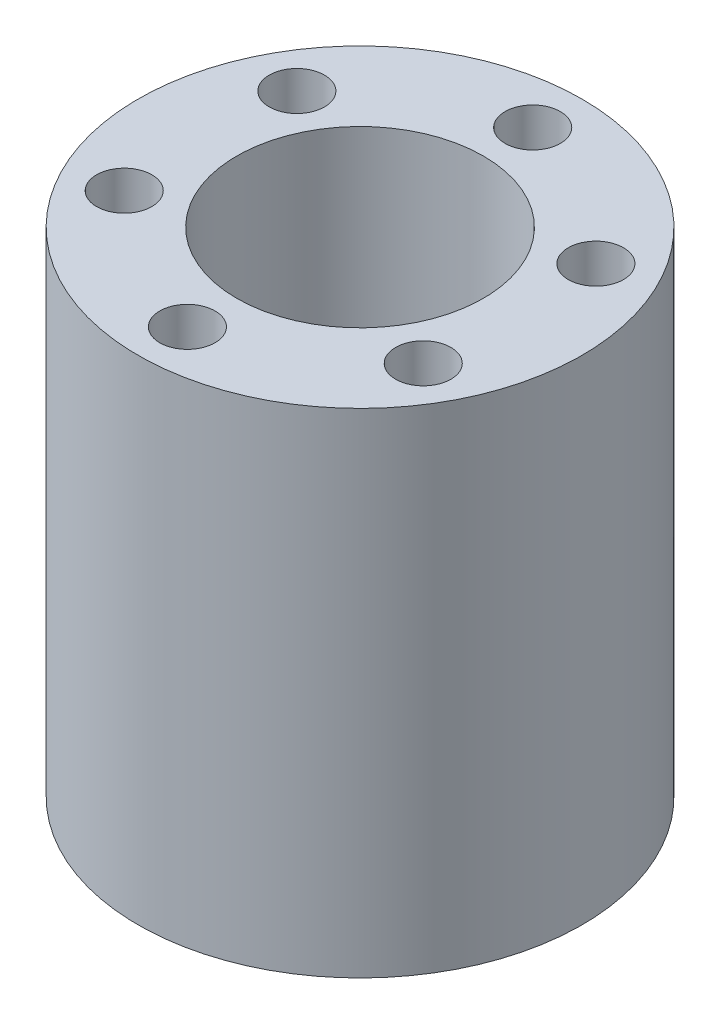
ISO-10303-21;
HEADER;
FILE_DESCRIPTION(('STEP AP214'),'2;1');
FILE_NAME('part.step','',(''),(''),'','','');
FILE_SCHEMA(('AUTOMOTIVE_DESIGN { 1 0 10303 214 1 1 1 1 }'));
ENDSEC;
DATA;
#1=APPLICATION_CONTEXT('core data for automotive mechanical design processes');
#2=APPLICATION_PROTOCOL_DEFINITION('international standard','automotive_design',2000,#1);
#3=PRODUCT_CONTEXT('',#1,'mechanical');
#4=PRODUCT('Part','Part','',(#3));
#5=PRODUCT_RELATED_PRODUCT_CATEGORY('part','',(#4));
#6=PRODUCT_DEFINITION_FORMATION('','',#4);
#7=PRODUCT_DEFINITION_CONTEXT('part definition',#1,'design');
#8=PRODUCT_DEFINITION('design','',#6,#7);
#9=PRODUCT_DEFINITION_SHAPE('','',#8);
#10=(LENGTH_UNIT() NAMED_UNIT(*) SI_UNIT(.MILLI.,.METRE.));
#11=(NAMED_UNIT(*) PLANE_ANGLE_UNIT() SI_UNIT($,.RADIAN.));
#12=(NAMED_UNIT(*) SI_UNIT($,.STERADIAN.) SOLID_ANGLE_UNIT());
#13=UNCERTAINTY_MEASURE_WITH_UNIT(LENGTH_MEASURE(1.E-05),#10,'distance_accuracy_value','');
#14=(GEOMETRIC_REPRESENTATION_CONTEXT(3) GLOBAL_UNCERTAINTY_ASSIGNED_CONTEXT((#13)) GLOBAL_UNIT_ASSIGNED_CONTEXT((#10,
#11,#12)) REPRESENTATION_CONTEXT('',''));
#15=CARTESIAN_POINT('',(0.,0.,0.));
#16=DIRECTION('',(0.,0.,1.));
#17=DIRECTION('',(1.,0.,0.));
#18=AXIS2_PLACEMENT_3D('',#15,#16,#17);
#19=CARTESIAN_POINT('',(0.,0.,0.));
#20=DIRECTION('',(0.,-1.,0.));
#21=DIRECTION('',(0.,0.,-1.));
#22=AXIS2_PLACEMENT_3D('',#19,#20,#21);
#23=CYLINDRICAL_SURFACE('',#22,12.5);
#24=CARTESIAN_POINT('',(0.,25.,0.));
#25=DIRECTION('',(0.,-1.,0.));
#26=DIRECTION('',(0.,0.,-1.));
#27=AXIS2_PLACEMENT_3D('',#24,#25,#26);
#28=CIRCLE('',#27,12.5);
#29=CARTESIAN_POINT('',(0.,25.,-12.5));
#30=VERTEX_POINT('',#29);
#31=EDGE_CURVE('E11',#30,#30,#28,.T.);
#32=ORIENTED_EDGE('',*,*,#31,.F.);
#33=EDGE_LOOP('',(#32));
#34=FACE_BOUND('',#33,.T.);
#35=CARTESIAN_POINT('',(0.,-25.,0.));
#36=DIRECTION('',(0.,-1.,0.));
#37=DIRECTION('',(0.,0.,-1.));
#38=AXIS2_PLACEMENT_3D('',#35,#36,#37);
#39=CIRCLE('',#38,12.5);
#40=CARTESIAN_POINT('',(0.,-25.,-12.5));
#41=VERTEX_POINT('',#40);
#42=EDGE_CURVE('E151',#41,#41,#39,.T.);
#43=ORIENTED_EDGE('',*,*,#42,.T.);
#44=EDGE_LOOP('',(#43));
#45=FACE_BOUND('',#44,.T.);
#46=ADVANCED_FACE('F45',(#34,#45),#23,.F.);
#47=CARTESIAN_POINT('',(12.5,25.,0.));
#48=DIRECTION('',(0.,1.,0.));
#49=DIRECTION('',(0.,0.,1.));
#50=AXIS2_PLACEMENT_3D('',#47,#48,#49);
#51=PLANE('',#50);
#52=CARTESIAN_POINT('',(0.,25.,17.5));
#53=DIRECTION('',(0.,1.,0.));
#54=DIRECTION('',(0.,0.,1.));
#55=AXIS2_PLACEMENT_3D('',#52,#53,#54);
#56=CIRCLE('',#55,2.79999999999999);
#57=CARTESIAN_POINT('',(0.,25.,20.3));
#58=VERTEX_POINT('',#57);
#59=EDGE_CURVE('E155',#58,#58,#56,.T.);
#60=ORIENTED_EDGE('',*,*,#59,.F.);
#61=EDGE_LOOP('',(#60));
#62=FACE_BOUND('',#61,.T.);
#63=CARTESIAN_POINT('',(-15.1554445662277,25.,8.74999999999997));
#64=DIRECTION('',(0.,1.,0.));
#65=DIRECTION('',(0.,0.,1.));
#66=AXIS2_PLACEMENT_3D('',#63,#64,#65);
#67=CIRCLE('',#66,2.79999999999999);
#68=CARTESIAN_POINT('',(-15.1554445662277,25.,11.55));
#69=VERTEX_POINT('',#68);
#70=EDGE_CURVE('E163',#69,#69,#67,.T.);
#71=ORIENTED_EDGE('',*,*,#70,.F.);
#72=EDGE_LOOP('',(#71));
#73=FACE_BOUND('',#72,.T.);
#74=CARTESIAN_POINT('',(-15.1554445662276,25.,-8.75000000000007));
#75=DIRECTION('',(0.,1.,0.));
#76=DIRECTION('',(0.,0.,1.));
#77=AXIS2_PLACEMENT_3D('',#74,#75,#76);
#78=CIRCLE('',#77,2.79999999999999);
#79=CARTESIAN_POINT('',(-15.1554445662276,25.,-5.95000000000008));
#80=VERTEX_POINT('',#79);
#81=EDGE_CURVE('E171',#80,#80,#78,.T.);
#82=ORIENTED_EDGE('',*,*,#81,.F.);
#83=EDGE_LOOP('',(#82));
#84=FACE_BOUND('',#83,.T.);
#85=CARTESIAN_POINT('',(1.2220184685951E-13,25.,-17.5));
#86=DIRECTION('',(0.,1.,0.));
#87=DIRECTION('',(0.,0.,1.));
#88=AXIS2_PLACEMENT_3D('',#85,#86,#87);
#89=CIRCLE('',#88,2.79999999999999);
#90=CARTESIAN_POINT('',(1.2220184685951E-13,25.,-14.7));
#91=VERTEX_POINT('',#90);
#92=EDGE_CURVE('E179',#91,#91,#89,.T.);
#93=ORIENTED_EDGE('',*,*,#92,.F.);
#94=EDGE_LOOP('',(#93));
#95=FACE_BOUND('',#94,.T.);
#96=CARTESIAN_POINT('',(15.1554445662278,25.,-8.74999999999986));
#97=DIRECTION('',(0.,1.,0.));
#98=DIRECTION('',(0.,0.,1.));
#99=AXIS2_PLACEMENT_3D('',#96,#97,#98);
#100=CIRCLE('',#99,2.79999999999999);
#101=CARTESIAN_POINT('',(15.1554445662278,25.,-5.94999999999987));
#102=VERTEX_POINT('',#101);
#103=EDGE_CURVE('E187',#102,#102,#100,.T.);
#104=ORIENTED_EDGE('',*,*,#103,.F.);
#105=EDGE_LOOP('',(#104));
#106=FACE_BOUND('',#105,.T.);
#107=CARTESIAN_POINT('',(15.1554445662276,25.,8.75000000000018));
#108=DIRECTION('',(0.,1.,0.));
#109=DIRECTION('',(0.,0.,1.));
#110=AXIS2_PLACEMENT_3D('',#107,#108,#109);
#111=CIRCLE('',#110,2.79999999999999);
#112=CARTESIAN_POINT('',(15.1554445662276,25.,11.5500000000002));
#113=VERTEX_POINT('',#112);
#114=EDGE_CURVE('E195',#113,#113,#111,.T.);
#115=ORIENTED_EDGE('',*,*,#114,.F.);
#116=EDGE_LOOP('',(#115));
#117=FACE_BOUND('',#116,.T.);
#118=ORIENTED_EDGE('',*,*,#31,.T.);
#119=EDGE_LOOP('',(#118));
#120=FACE_BOUND('',#119,.T.);
#121=CARTESIAN_POINT('',(0.,25.,0.));
#122=DIRECTION('',(0.,-1.,0.));
#123=DIRECTION('',(0.,0.,-1.));
#124=AXIS2_PLACEMENT_3D('',#121,#122,#123);
#125=CIRCLE('',#124,22.5);
#126=CARTESIAN_POINT('',(0.,25.,-22.5));
#127=VERTEX_POINT('',#126);
#128=EDGE_CURVE('E53',#127,#127,#125,.T.);
#129=ORIENTED_EDGE('',*,*,#128,.F.);
#130=EDGE_LOOP('',(#129));
#131=FACE_BOUND('',#130,.T.);
#132=ADVANCED_FACE('F209',(#62,#73,#84,#95,#106,#117,#120,#131),#51,.T.);
#133=CARTESIAN_POINT('',(0.,0.,0.));
#134=DIRECTION('',(0.,-1.,0.));
#135=DIRECTION('',(0.,0.,-1.));
#136=AXIS2_PLACEMENT_3D('',#133,#134,#135);
#137=CYLINDRICAL_SURFACE('',#136,22.5);
#138=ORIENTED_EDGE('',*,*,#128,.T.);
#139=EDGE_LOOP('',(#138));
#140=FACE_BOUND('',#139,.T.);
#141=CARTESIAN_POINT('',(0.,-25.,0.));
#142=DIRECTION('',(0.,-1.,0.));
#143=DIRECTION('',(0.,0.,-1.));
#144=AXIS2_PLACEMENT_3D('',#141,#142,#143);
#145=CIRCLE('',#144,22.5);
#146=CARTESIAN_POINT('',(0.,-25.,-22.5));
#147=VERTEX_POINT('',#146);
#148=EDGE_CURVE('E147',#147,#147,#145,.T.);
#149=ORIENTED_EDGE('',*,*,#148,.F.);
#150=EDGE_LOOP('',(#149));
#151=FACE_BOUND('',#150,.T.);
#152=ADVANCED_FACE('F206',(#140,#151),#137,.T.);
#153=CARTESIAN_POINT('',(15.1554445662276,17.,8.75000000000018));
#154=DIRECTION('',(0.,1.,0.));
#155=DIRECTION('',(0.,0.,1.));
#156=AXIS2_PLACEMENT_3D('',#153,#154,#155);
#157=CONICAL_SURFACE('',#156,2.79999999999999,1.02974425867665);
#158=CARTESIAN_POINT('',(15.1554445662276,15.3175902667228,8.75000000000018));
#159=VERTEX_POINT('',#158);
#160=VERTEX_LOOP('',#159);
#161=FACE_BOUND('',#160,.T.);
#162=CARTESIAN_POINT('',(15.1554445662276,17.,8.75000000000018));
#163=DIRECTION('',(0.,1.,0.));
#164=DIRECTION('',(0.,0.,1.));
#165=AXIS2_PLACEMENT_3D('',#162,#163,#164);
#166=CIRCLE('',#165,2.79999999999999);
#167=CARTESIAN_POINT('',(15.1554445662276,17.,11.5500000000002));
#168=VERTEX_POINT('',#167);
#169=EDGE_CURVE('E199',#168,#168,#166,.T.);
#170=ORIENTED_EDGE('',*,*,#169,.T.);
#171=EDGE_LOOP('',(#170));
#172=FACE_BOUND('',#171,.T.);
#173=ADVANCED_FACE('F216',(#161,#172),#157,.F.);
#174=CARTESIAN_POINT('',(15.1554445662276,25.,8.75000000000018));
#175=DIRECTION('',(0.,1.,0.));
#176=DIRECTION('',(0.,0.,1.));
#177=AXIS2_PLACEMENT_3D('',#174,#175,#176);
#178=CYLINDRICAL_SURFACE('',#177,2.79999999999999);
#179=ORIENTED_EDGE('',*,*,#169,.F.);
#180=EDGE_LOOP('',(#179));
#181=FACE_BOUND('',#180,.T.);
#182=ORIENTED_EDGE('',*,*,#114,.T.);
#183=EDGE_LOOP('',(#182));
#184=FACE_BOUND('',#183,.T.);
#185=ADVANCED_FACE('F224',(#181,#184),#178,.F.);
#186=CARTESIAN_POINT('',(15.1554445662278,17.,-8.74999999999986));
#187=DIRECTION('',(0.,1.,0.));
#188=DIRECTION('',(0.,0.,1.));
#189=AXIS2_PLACEMENT_3D('',#186,#187,#188);
#190=CONICAL_SURFACE('',#189,2.79999999999999,1.02974425867665);
#191=CARTESIAN_POINT('',(15.1554445662278,15.3175902667228,-8.74999999999986));
#192=VERTEX_POINT('',#191);
#193=VERTEX_LOOP('',#192);
#194=FACE_BOUND('',#193,.T.);
#195=CARTESIAN_POINT('',(15.1554445662278,17.,-8.74999999999986));
#196=DIRECTION('',(0.,1.,0.));
#197=DIRECTION('',(0.,0.,1.));
#198=AXIS2_PLACEMENT_3D('',#195,#196,#197);
#199=CIRCLE('',#198,2.79999999999999);
#200=CARTESIAN_POINT('',(15.1554445662278,17.,-5.94999999999987));
#201=VERTEX_POINT('',#200);
#202=EDGE_CURVE('E191',#201,#201,#199,.T.);
#203=ORIENTED_EDGE('',*,*,#202,.T.);
#204=EDGE_LOOP('',(#203));
#205=FACE_BOUND('',#204,.T.);
#206=ADVANCED_FACE('F227',(#194,#205),#190,.F.);
#207=CARTESIAN_POINT('',(15.1554445662278,25.,-8.74999999999986));
#208=DIRECTION('',(0.,1.,0.));
#209=DIRECTION('',(0.,0.,1.));
#210=AXIS2_PLACEMENT_3D('',#207,#208,#209);
#211=CYLINDRICAL_SURFACE('',#210,2.79999999999999);
#212=ORIENTED_EDGE('',*,*,#202,.F.);
#213=EDGE_LOOP('',(#212));
#214=FACE_BOUND('',#213,.T.);
#215=ORIENTED_EDGE('',*,*,#103,.T.);
#216=EDGE_LOOP('',(#215));
#217=FACE_BOUND('',#216,.T.);
#218=ADVANCED_FACE('F231',(#214,#217),#211,.F.);
#219=CARTESIAN_POINT('',(1.2220184685951E-13,17.,-17.5));
#220=DIRECTION('',(0.,1.,0.));
#221=DIRECTION('',(0.,0.,1.));
#222=AXIS2_PLACEMENT_3D('',#219,#220,#221);
#223=CONICAL_SURFACE('',#222,2.79999999999999,1.02974425867665);
#224=CARTESIAN_POINT('',(1.19830340441931E-13,15.3175902667228,-17.5));
#225=VERTEX_POINT('',#224);
#226=VERTEX_LOOP('',#225);
#227=FACE_BOUND('',#226,.T.);
#228=CARTESIAN_POINT('',(1.2220184685951E-13,17.,-17.5));
#229=DIRECTION('',(0.,1.,0.));
#230=DIRECTION('',(0.,0.,1.));
#231=AXIS2_PLACEMENT_3D('',#228,#229,#230);
#232=CIRCLE('',#231,2.79999999999999);
#233=CARTESIAN_POINT('',(1.2220184685951E-13,17.,-14.7));
#234=VERTEX_POINT('',#233);
#235=EDGE_CURVE('E183',#234,#234,#232,.T.);
#236=ORIENTED_EDGE('',*,*,#235,.T.);
#237=EDGE_LOOP('',(#236));
#238=FACE_BOUND('',#237,.T.);
#239=ADVANCED_FACE('F234',(#227,#238),#223,.F.);
#240=CARTESIAN_POINT('',(1.2220184685951E-13,25.,-17.5));
#241=DIRECTION('',(0.,1.,0.));
#242=DIRECTION('',(0.,0.,1.));
#243=AXIS2_PLACEMENT_3D('',#240,#241,#242);
#244=CYLINDRICAL_SURFACE('',#243,2.79999999999999);
#245=ORIENTED_EDGE('',*,*,#235,.F.);
#246=EDGE_LOOP('',(#245));
#247=FACE_BOUND('',#246,.T.);
#248=ORIENTED_EDGE('',*,*,#92,.T.);
#249=EDGE_LOOP('',(#248));
#250=FACE_BOUND('',#249,.T.);
#251=ADVANCED_FACE('F238',(#247,#250),#244,.F.);
#252=CARTESIAN_POINT('',(-15.1554445662276,17.,-8.75000000000007));
#253=DIRECTION('',(0.,1.,0.));
#254=DIRECTION('',(0.,0.,1.));
#255=AXIS2_PLACEMENT_3D('',#252,#253,#254);
#256=CONICAL_SURFACE('',#255,2.79999999999999,1.02974425867665);
#257=CARTESIAN_POINT('',(-15.1554445662276,15.3175902667228,-8.75000000000007));
#258=VERTEX_POINT('',#257);
#259=VERTEX_LOOP('',#258);
#260=FACE_BOUND('',#259,.T.);
#261=CARTESIAN_POINT('',(-15.1554445662276,17.,-8.75000000000007));
#262=DIRECTION('',(0.,1.,0.));
#263=DIRECTION('',(0.,0.,1.));
#264=AXIS2_PLACEMENT_3D('',#261,#262,#263);
#265=CIRCLE('',#264,2.79999999999999);
#266=CARTESIAN_POINT('',(-15.1554445662276,17.,-5.95000000000008));
#267=VERTEX_POINT('',#266);
#268=EDGE_CURVE('E175',#267,#267,#265,.T.);
#269=ORIENTED_EDGE('',*,*,#268,.T.);
#270=EDGE_LOOP('',(#269));
#271=FACE_BOUND('',#270,.T.);
#272=ADVANCED_FACE('F242',(#260,#271),#256,.F.);
#273=CARTESIAN_POINT('',(-15.1554445662276,25.,-8.75000000000007));
#274=DIRECTION('',(0.,1.,0.));
#275=DIRECTION('',(0.,0.,1.));
#276=AXIS2_PLACEMENT_3D('',#273,#274,#275);
#277=CYLINDRICAL_SURFACE('',#276,2.79999999999999);
#278=ORIENTED_EDGE('',*,*,#268,.F.);
#279=EDGE_LOOP('',(#278));
#280=FACE_BOUND('',#279,.T.);
#281=ORIENTED_EDGE('',*,*,#81,.T.);
#282=EDGE_LOOP('',(#281));
#283=FACE_BOUND('',#282,.T.);
#284=ADVANCED_FACE('F246',(#280,#283),#277,.F.);
#285=CARTESIAN_POINT('',(-15.1554445662277,17.,8.74999999999997));
#286=DIRECTION('',(0.,1.,0.));
#287=DIRECTION('',(0.,0.,1.));
#288=AXIS2_PLACEMENT_3D('',#285,#286,#287);
#289=CONICAL_SURFACE('',#288,2.79999999999999,1.02974425867665);
#290=CARTESIAN_POINT('',(-15.1554445662277,15.3175902667228,8.74999999999997));
#291=VERTEX_POINT('',#290);
#292=VERTEX_LOOP('',#291);
#293=FACE_BOUND('',#292,.T.);
#294=CARTESIAN_POINT('',(-15.1554445662277,17.,8.74999999999997));
#295=DIRECTION('',(0.,1.,0.));
#296=DIRECTION('',(0.,0.,1.));
#297=AXIS2_PLACEMENT_3D('',#294,#295,#296);
#298=CIRCLE('',#297,2.79999999999999);
#299=CARTESIAN_POINT('',(-15.1554445662277,17.,11.55));
#300=VERTEX_POINT('',#299);
#301=EDGE_CURVE('E167',#300,#300,#298,.T.);
#302=ORIENTED_EDGE('',*,*,#301,.T.);
#303=EDGE_LOOP('',(#302));
#304=FACE_BOUND('',#303,.T.);
#305=ADVANCED_FACE('F250',(#293,#304),#289,.F.);
#306=CARTESIAN_POINT('',(-15.1554445662277,25.,8.74999999999997));
#307=DIRECTION('',(0.,1.,0.));
#308=DIRECTION('',(0.,0.,1.));
#309=AXIS2_PLACEMENT_3D('',#306,#307,#308);
#310=CYLINDRICAL_SURFACE('',#309,2.79999999999999);
#311=ORIENTED_EDGE('',*,*,#301,.F.);
#312=EDGE_LOOP('',(#311));
#313=FACE_BOUND('',#312,.T.);
#314=ORIENTED_EDGE('',*,*,#70,.T.);
#315=EDGE_LOOP('',(#314));
#316=FACE_BOUND('',#315,.T.);
#317=ADVANCED_FACE('F254',(#313,#316),#310,.F.);
#318=CARTESIAN_POINT('',(0.,17.,17.5));
#319=DIRECTION('',(0.,1.,0.));
#320=DIRECTION('',(0.,0.,1.));
#321=AXIS2_PLACEMENT_3D('',#318,#319,#320);
#322=CONICAL_SURFACE('',#321,2.79999999999999,1.02974425867665);
#323=CARTESIAN_POINT('',(0.,15.3175902667228,17.5));
#324=VERTEX_POINT('',#323);
#325=VERTEX_LOOP('',#324);
#326=FACE_BOUND('',#325,.T.);
#327=CARTESIAN_POINT('',(0.,17.,17.5));
#328=DIRECTION('',(0.,1.,0.));
#329=DIRECTION('',(0.,0.,1.));
#330=AXIS2_PLACEMENT_3D('',#327,#328,#329);
#331=CIRCLE('',#330,2.79999999999999);
#332=CARTESIAN_POINT('',(0.,17.,20.3));
#333=VERTEX_POINT('',#332);
#334=EDGE_CURVE('E159',#333,#333,#331,.T.);
#335=ORIENTED_EDGE('',*,*,#334,.T.);
#336=EDGE_LOOP('',(#335));
#337=FACE_BOUND('',#336,.T.);
#338=ADVANCED_FACE('F258',(#326,#337),#322,.F.);
#339=CARTESIAN_POINT('',(0.,25.,17.5));
#340=DIRECTION('',(0.,1.,0.));
#341=DIRECTION('',(0.,0.,1.));
#342=AXIS2_PLACEMENT_3D('',#339,#340,#341);
#343=CYLINDRICAL_SURFACE('',#342,2.79999999999999);
#344=ORIENTED_EDGE('',*,*,#334,.F.);
#345=EDGE_LOOP('',(#344));
#346=FACE_BOUND('',#345,.T.);
#347=ORIENTED_EDGE('',*,*,#59,.T.);
#348=EDGE_LOOP('',(#347));
#349=FACE_BOUND('',#348,.T.);
#350=ADVANCED_FACE('F262',(#346,#349),#343,.F.);
#351=CARTESIAN_POINT('',(12.5,-25.,0.));
#352=DIRECTION('',(0.,-1.,0.));
#353=DIRECTION('',(0.,0.,1.));
#354=AXIS2_PLACEMENT_3D('',#351,#352,#353);
#355=PLANE('',#354);
#356=CARTESIAN_POINT('',(0.,-25.,17.5));
#357=DIRECTION('',(0.,-1.,0.));
#358=DIRECTION('',(0.,0.,-1.));
#359=AXIS2_PLACEMENT_3D('',#356,#357,#358);
#360=CIRCLE('',#359,2.79999999999999);
#361=CARTESIAN_POINT('',(0.,-25.,14.7));
#362=VERTEX_POINT('',#361);
#363=EDGE_CURVE('E102',#362,#362,#360,.T.);
#364=ORIENTED_EDGE('',*,*,#363,.F.);
#365=EDGE_LOOP('',(#364));
#366=FACE_BOUND('',#365,.T.);
#367=CARTESIAN_POINT('',(-15.1554445662277,-25.,8.74999999999997));
#368=DIRECTION('',(0.,-1.,0.));
#369=DIRECTION('',(0.,0.,-1.));
#370=AXIS2_PLACEMENT_3D('',#367,#368,#369);
#371=CIRCLE('',#370,2.79999999999999);
#372=CARTESIAN_POINT('',(-15.1554445662277,-25.,5.94999999999998));
#373=VERTEX_POINT('',#372);
#374=EDGE_CURVE('E101',#373,#373,#371,.T.);
#375=ORIENTED_EDGE('',*,*,#374,.F.);
#376=EDGE_LOOP('',(#375));
#377=FACE_BOUND('',#376,.T.);
#378=CARTESIAN_POINT('',(-15.1554445662276,-25.,-8.75000000000007));
#379=DIRECTION('',(0.,-1.,0.));
#380=DIRECTION('',(0.,0.,-1.));
#381=AXIS2_PLACEMENT_3D('',#378,#379,#380);
#382=CIRCLE('',#381,2.79999999999999);
#383=CARTESIAN_POINT('',(-15.1554445662276,-25.,-11.5500000000001));
#384=VERTEX_POINT('',#383);
#385=EDGE_CURVE('E115',#384,#384,#382,.T.);
#386=ORIENTED_EDGE('',*,*,#385,.F.);
#387=EDGE_LOOP('',(#386));
#388=FACE_BOUND('',#387,.T.);
#389=CARTESIAN_POINT('',(1.2220184685951E-13,-25.,-17.5));
#390=DIRECTION('',(0.,-1.,0.));
#391=DIRECTION('',(0.,0.,-1.));
#392=AXIS2_PLACEMENT_3D('',#389,#390,#391);
#393=CIRCLE('',#392,2.79999999999999);
#394=CARTESIAN_POINT('',(1.2220184685951E-13,-25.,-20.3));
#395=VERTEX_POINT('',#394);
#396=EDGE_CURVE('E123',#395,#395,#393,.T.);
#397=ORIENTED_EDGE('',*,*,#396,.F.);
#398=EDGE_LOOP('',(#397));
#399=FACE_BOUND('',#398,.T.);
#400=CARTESIAN_POINT('',(15.1554445662278,-25.,-8.74999999999986));
#401=DIRECTION('',(0.,-1.,0.));
#402=DIRECTION('',(0.,0.,-1.));
#403=AXIS2_PLACEMENT_3D('',#400,#401,#402);
#404=CIRCLE('',#403,2.79999999999999);
#405=CARTESIAN_POINT('',(15.1554445662278,-25.,-11.5499999999998));
#406=VERTEX_POINT('',#405);
#407=EDGE_CURVE('E131',#406,#406,#404,.T.);
#408=ORIENTED_EDGE('',*,*,#407,.F.);
#409=EDGE_LOOP('',(#408));
#410=FACE_BOUND('',#409,.T.);
#411=CARTESIAN_POINT('',(15.1554445662276,-25.,8.75000000000018));
#412=DIRECTION('',(0.,-1.,0.));
#413=DIRECTION('',(0.,0.,-1.));
#414=AXIS2_PLACEMENT_3D('',#411,#412,#413);
#415=CIRCLE('',#414,2.79999999999999);
#416=CARTESIAN_POINT('',(15.1554445662276,-25.,5.95000000000019));
#417=VERTEX_POINT('',#416);
#418=EDGE_CURVE('E139',#417,#417,#415,.T.);
#419=ORIENTED_EDGE('',*,*,#418,.F.);
#420=EDGE_LOOP('',(#419));
#421=FACE_BOUND('',#420,.T.);
#422=ORIENTED_EDGE('',*,*,#42,.F.);
#423=EDGE_LOOP('',(#422));
#424=FACE_BOUND('',#423,.T.);
#425=ORIENTED_EDGE('',*,*,#148,.T.);
#426=EDGE_LOOP('',(#425));
#427=FACE_BOUND('',#426,.T.);
#428=ADVANCED_FACE('F266',(#366,#377,#388,#399,#410,#421,#424,#427),#355,.T.);
#429=CARTESIAN_POINT('',(15.1554445662276,-17.,8.75000000000018));
#430=DIRECTION('',(0.,-1.,0.));
#431=DIRECTION('',(0.,0.,-1.));
#432=AXIS2_PLACEMENT_3D('',#429,#430,#431);
#433=CONICAL_SURFACE('',#432,2.79999999999999,1.02974425867665);
#434=CARTESIAN_POINT('',(15.1554445662276,-15.3175902667228,8.75000000000018));
#435=VERTEX_POINT('',#434);
#436=VERTEX_LOOP('',#435);
#437=FACE_BOUND('',#436,.T.);
#438=CARTESIAN_POINT('',(15.1554445662276,-17.,8.75000000000018));
#439=DIRECTION('',(0.,-1.,0.));
#440=DIRECTION('',(0.,0.,-1.));
#441=AXIS2_PLACEMENT_3D('',#438,#439,#440);
#442=CIRCLE('',#441,2.79999999999999);
#443=CARTESIAN_POINT('',(15.1554445662276,-17.,5.95000000000019));
#444=VERTEX_POINT('',#443);
#445=EDGE_CURVE('E143',#444,#444,#442,.T.);
#446=ORIENTED_EDGE('',*,*,#445,.T.);
#447=EDGE_LOOP('',(#446));
#448=FACE_BOUND('',#447,.T.);
#449=ADVANCED_FACE('F270',(#437,#448),#433,.F.);
#450=CARTESIAN_POINT('',(15.1554445662276,-25.,8.75000000000018));
#451=DIRECTION('',(0.,-1.,0.));
#452=DIRECTION('',(0.,0.,-1.));
#453=AXIS2_PLACEMENT_3D('',#450,#451,#452);
#454=CYLINDRICAL_SURFACE('',#453,2.79999999999999);
#455=ORIENTED_EDGE('',*,*,#445,.F.);
#456=EDGE_LOOP('',(#455));
#457=FACE_BOUND('',#456,.T.);
#458=ORIENTED_EDGE('',*,*,#418,.T.);
#459=EDGE_LOOP('',(#458));
#460=FACE_BOUND('',#459,.T.);
#461=ADVANCED_FACE('F274',(#457,#460),#454,.F.);
#462=CARTESIAN_POINT('',(15.1554445662278,-17.,-8.74999999999986));
#463=DIRECTION('',(0.,-1.,0.));
#464=DIRECTION('',(0.,0.,-1.));
#465=AXIS2_PLACEMENT_3D('',#462,#463,#464);
#466=CONICAL_SURFACE('',#465,2.79999999999999,1.02974425867665);
#467=CARTESIAN_POINT('',(15.1554445662278,-15.3175902667228,-8.74999999999986));
#468=VERTEX_POINT('',#467);
#469=VERTEX_LOOP('',#468);
#470=FACE_BOUND('',#469,.T.);
#471=CARTESIAN_POINT('',(15.1554445662278,-17.,-8.74999999999986));
#472=DIRECTION('',(0.,-1.,0.));
#473=DIRECTION('',(0.,0.,-1.));
#474=AXIS2_PLACEMENT_3D('',#471,#472,#473);
#475=CIRCLE('',#474,2.79999999999999);
#476=CARTESIAN_POINT('',(15.1554445662278,-17.,-11.5499999999998));
#477=VERTEX_POINT('',#476);
#478=EDGE_CURVE('E135',#477,#477,#475,.T.);
#479=ORIENTED_EDGE('',*,*,#478,.T.);
#480=EDGE_LOOP('',(#479));
#481=FACE_BOUND('',#480,.T.);
#482=ADVANCED_FACE('F278',(#470,#481),#466,.F.);
#483=CARTESIAN_POINT('',(15.1554445662278,-25.,-8.74999999999986));
#484=DIRECTION('',(0.,-1.,0.));
#485=DIRECTION('',(0.,0.,-1.));
#486=AXIS2_PLACEMENT_3D('',#483,#484,#485);
#487=CYLINDRICAL_SURFACE('',#486,2.79999999999999);
#488=ORIENTED_EDGE('',*,*,#478,.F.);
#489=EDGE_LOOP('',(#488));
#490=FACE_BOUND('',#489,.T.);
#491=ORIENTED_EDGE('',*,*,#407,.T.);
#492=EDGE_LOOP('',(#491));
#493=FACE_BOUND('',#492,.T.);
#494=ADVANCED_FACE('F282',(#490,#493),#487,.F.);
#495=CARTESIAN_POINT('',(1.2220184685951E-13,-17.,-17.5));
#496=DIRECTION('',(0.,-1.,0.));
#497=DIRECTION('',(0.,0.,-1.));
#498=AXIS2_PLACEMENT_3D('',#495,#496,#497);
#499=CONICAL_SURFACE('',#498,2.79999999999999,1.02974425867665);
#500=CARTESIAN_POINT('',(1.19830340441931E-13,-15.3175902667228,-17.5));
#501=VERTEX_POINT('',#500);
#502=VERTEX_LOOP('',#501);
#503=FACE_BOUND('',#502,.T.);
#504=CARTESIAN_POINT('',(1.2220184685951E-13,-17.,-17.5));
#505=DIRECTION('',(0.,-1.,0.));
#506=DIRECTION('',(0.,0.,-1.));
#507=AXIS2_PLACEMENT_3D('',#504,#505,#506);
#508=CIRCLE('',#507,2.79999999999999);
#509=CARTESIAN_POINT('',(1.2220184685951E-13,-17.,-20.3));
#510=VERTEX_POINT('',#509);
#511=EDGE_CURVE('E127',#510,#510,#508,.T.);
#512=ORIENTED_EDGE('',*,*,#511,.T.);
#513=EDGE_LOOP('',(#512));
#514=FACE_BOUND('',#513,.T.);
#515=ADVANCED_FACE('F286',(#503,#514),#499,.F.);
#516=CARTESIAN_POINT('',(1.2220184685951E-13,-25.,-17.5));
#517=DIRECTION('',(0.,-1.,0.));
#518=DIRECTION('',(0.,0.,-1.));
#519=AXIS2_PLACEMENT_3D('',#516,#517,#518);
#520=CYLINDRICAL_SURFACE('',#519,2.79999999999999);
#521=ORIENTED_EDGE('',*,*,#511,.F.);
#522=EDGE_LOOP('',(#521));
#523=FACE_BOUND('',#522,.T.);
#524=ORIENTED_EDGE('',*,*,#396,.T.);
#525=EDGE_LOOP('',(#524));
#526=FACE_BOUND('',#525,.T.);
#527=ADVANCED_FACE('F290',(#523,#526),#520,.F.);
#528=CARTESIAN_POINT('',(-15.1554445662276,-17.,-8.75000000000007));
#529=DIRECTION('',(0.,-1.,0.));
#530=DIRECTION('',(0.,0.,-1.));
#531=AXIS2_PLACEMENT_3D('',#528,#529,#530);
#532=CONICAL_SURFACE('',#531,2.79999999999999,1.02974425867665);
#533=CARTESIAN_POINT('',(-15.1554445662276,-15.3175902667228,-8.75000000000007));
#534=VERTEX_POINT('',#533);
#535=VERTEX_LOOP('',#534);
#536=FACE_BOUND('',#535,.T.);
#537=CARTESIAN_POINT('',(-15.1554445662276,-17.,-8.75000000000007));
#538=DIRECTION('',(0.,-1.,0.));
#539=DIRECTION('',(0.,0.,-1.));
#540=AXIS2_PLACEMENT_3D('',#537,#538,#539);
#541=CIRCLE('',#540,2.79999999999999);
#542=CARTESIAN_POINT('',(-15.1554445662276,-17.,-11.5500000000001));
#543=VERTEX_POINT('',#542);
#544=EDGE_CURVE('E119',#543,#543,#541,.T.);
#545=ORIENTED_EDGE('',*,*,#544,.T.);
#546=EDGE_LOOP('',(#545));
#547=FACE_BOUND('',#546,.T.);
#548=ADVANCED_FACE('F294',(#536,#547),#532,.F.);
#549=CARTESIAN_POINT('',(-15.1554445662276,-25.,-8.75000000000007));
#550=DIRECTION('',(0.,-1.,0.));
#551=DIRECTION('',(0.,0.,-1.));
#552=AXIS2_PLACEMENT_3D('',#549,#550,#551);
#553=CYLINDRICAL_SURFACE('',#552,2.79999999999999);
#554=ORIENTED_EDGE('',*,*,#544,.F.);
#555=EDGE_LOOP('',(#554));
#556=FACE_BOUND('',#555,.T.);
#557=ORIENTED_EDGE('',*,*,#385,.T.);
#558=EDGE_LOOP('',(#557));
#559=FACE_BOUND('',#558,.T.);
#560=ADVANCED_FACE('F298',(#556,#559),#553,.F.);
#561=CARTESIAN_POINT('',(-15.1554445662277,-17.,8.74999999999997));
#562=DIRECTION('',(0.,-1.,0.));
#563=DIRECTION('',(0.,0.,-1.));
#564=AXIS2_PLACEMENT_3D('',#561,#562,#563);
#565=CONICAL_SURFACE('',#564,2.79999999999999,1.02974425867665);
#566=CARTESIAN_POINT('',(-15.1554445662277,-15.3175902667228,8.74999999999997));
#567=VERTEX_POINT('',#566);
#568=VERTEX_LOOP('',#567);
#569=FACE_BOUND('',#568,.T.);
#570=CARTESIAN_POINT('',(-15.1554445662277,-17.,8.74999999999997));
#571=DIRECTION('',(0.,-1.,0.));
#572=DIRECTION('',(0.,0.,-1.));
#573=AXIS2_PLACEMENT_3D('',#570,#571,#572);
#574=CIRCLE('',#573,2.79999999999999);
#575=CARTESIAN_POINT('',(-15.1554445662277,-17.,5.94999999999998));
#576=VERTEX_POINT('',#575);
#577=EDGE_CURVE('E107',#576,#576,#574,.T.);
#578=ORIENTED_EDGE('',*,*,#577,.T.);
#579=EDGE_LOOP('',(#578));
#580=FACE_BOUND('',#579,.T.);
#581=ADVANCED_FACE('F302',(#569,#580),#565,.F.);
#582=CARTESIAN_POINT('',(-15.1554445662277,-25.,8.74999999999997));
#583=DIRECTION('',(0.,-1.,0.));
#584=DIRECTION('',(0.,0.,-1.));
#585=AXIS2_PLACEMENT_3D('',#582,#583,#584);
#586=CYLINDRICAL_SURFACE('',#585,2.79999999999999);
#587=ORIENTED_EDGE('',*,*,#577,.F.);
#588=EDGE_LOOP('',(#587));
#589=FACE_BOUND('',#588,.T.);
#590=ORIENTED_EDGE('',*,*,#374,.T.);
#591=EDGE_LOOP('',(#590));
#592=FACE_BOUND('',#591,.T.);
#593=ADVANCED_FACE('F94',(#589,#592),#586,.F.);
#594=CARTESIAN_POINT('',(0.,-17.,17.5));
#595=DIRECTION('',(0.,-1.,0.));
#596=DIRECTION('',(0.,0.,-1.));
#597=AXIS2_PLACEMENT_3D('',#594,#595,#596);
#598=CONICAL_SURFACE('',#597,2.79999999999999,1.02974425867665);
#599=CARTESIAN_POINT('',(0.,-15.3175902667228,17.5));
#600=VERTEX_POINT('',#599);
#601=VERTEX_LOOP('',#600);
#602=FACE_BOUND('',#601,.T.);
#603=CARTESIAN_POINT('',(0.,-17.,17.5));
#604=DIRECTION('',(0.,-1.,0.));
#605=DIRECTION('',(0.,0.,-1.));
#606=AXIS2_PLACEMENT_3D('',#603,#604,#605);
#607=CIRCLE('',#606,2.79999999999999);
#608=CARTESIAN_POINT('',(0.,-17.,14.7));
#609=VERTEX_POINT('',#608);
#610=EDGE_CURVE('E98',#609,#609,#607,.T.);
#611=ORIENTED_EDGE('',*,*,#610,.T.);
#612=EDGE_LOOP('',(#611));
#613=FACE_BOUND('',#612,.T.);
#614=ADVANCED_FACE('F90',(#602,#613),#598,.F.);
#615=CARTESIAN_POINT('',(0.,-25.,17.5));
#616=DIRECTION('',(0.,-1.,0.));
#617=DIRECTION('',(0.,0.,-1.));
#618=AXIS2_PLACEMENT_3D('',#615,#616,#617);
#619=CYLINDRICAL_SURFACE('',#618,2.79999999999999);
#620=ORIENTED_EDGE('',*,*,#610,.F.);
#621=EDGE_LOOP('',(#620));
#622=FACE_BOUND('',#621,.T.);
#623=ORIENTED_EDGE('',*,*,#363,.T.);
#624=EDGE_LOOP('',(#623));
#625=FACE_BOUND('',#624,.T.);
#626=ADVANCED_FACE('F93',(#622,#625),#619,.F.);
#627=CLOSED_SHELL('',(#46,#132,#152,#173,#185,#206,#218,#239,#251,#272,#284,#305,#317,#338,#350,
#428,#449,#461,#482,#494,#515,#527,#548,#560,#581,#593,#614,#626));
#628=MANIFOLD_SOLID_BREP('B2',#627);
#629=ADVANCED_BREP_SHAPE_REPRESENTATION('',(#18,#628),#14);
#630=SHAPE_DEFINITION_REPRESENTATION(#9,#629);
ENDSEC;
END-ISO-10303-21;
